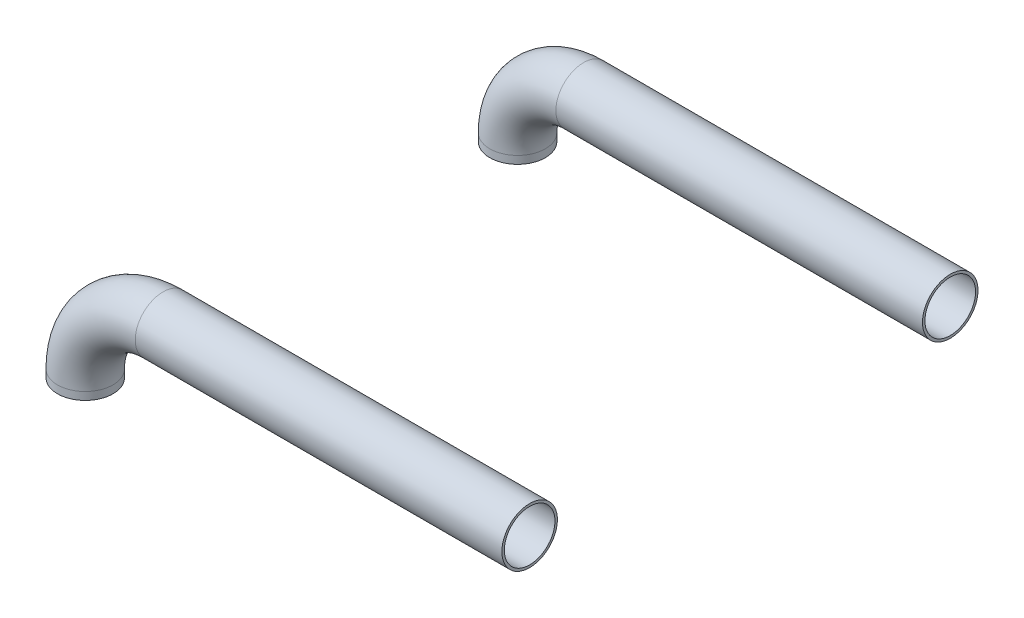
ISO-10303-21;
HEADER;
FILE_DESCRIPTION(('STEP AP214'),'2;1');
FILE_NAME('part.step','',(''),(''),'','','');
FILE_SCHEMA(('AUTOMOTIVE_DESIGN { 1 0 10303 214 1 1 1 1 }'));
ENDSEC;
DATA;
#1=APPLICATION_CONTEXT('core data for automotive mechanical design processes');
#2=APPLICATION_PROTOCOL_DEFINITION('international standard','automotive_design',2000,#1);
#3=PRODUCT_CONTEXT('',#1,'mechanical');
#4=PRODUCT('Part','Part','',(#3));
#5=PRODUCT_RELATED_PRODUCT_CATEGORY('part','',(#4));
#6=PRODUCT_DEFINITION_FORMATION('','',#4);
#7=PRODUCT_DEFINITION_CONTEXT('part definition',#1,'design');
#8=PRODUCT_DEFINITION('design','',#6,#7);
#9=PRODUCT_DEFINITION_SHAPE('','',#8);
#10=(LENGTH_UNIT() NAMED_UNIT(*) SI_UNIT(.MILLI.,.METRE.));
#11=(NAMED_UNIT(*) PLANE_ANGLE_UNIT() SI_UNIT($,.RADIAN.));
#12=(NAMED_UNIT(*) SI_UNIT($,.STERADIAN.) SOLID_ANGLE_UNIT());
#13=UNCERTAINTY_MEASURE_WITH_UNIT(LENGTH_MEASURE(1.E-05),#10,'distance_accuracy_value','');
#14=(GEOMETRIC_REPRESENTATION_CONTEXT(3) GLOBAL_UNCERTAINTY_ASSIGNED_CONTEXT((#13)) GLOBAL_UNIT_ASSIGNED_CONTEXT((#10,
#11,#12)) REPRESENTATION_CONTEXT('',''));
#15=CARTESIAN_POINT('',(0.,0.,0.));
#16=DIRECTION('',(0.,0.,1.));
#17=DIRECTION('',(1.,0.,0.));
#18=AXIS2_PLACEMENT_3D('',#15,#16,#17);
#19=CARTESIAN_POINT('',(386.894037312899,284.8,-164.945872952095));
#20=DIRECTION('',(0.,1.,2.40312621775402E-13));
#21=DIRECTION('',(0.,-2.40312621775402E-13,1.));
#22=AXIS2_PLACEMENT_3D('',#19,#20,#21);
#23=CYLINDRICAL_SURFACE('',#22,25.);
#24=CARTESIAN_POINT('',(386.894037312899,284.833265673216,-164.945872952095));
#25=DIRECTION('',(0.,1.,0.));
#26=DIRECTION('',(0.,0.,1.));
#27=AXIS2_PLACEMENT_3D('',#24,#25,#26);
#28=CIRCLE('',#27,25.);
#29=CARTESIAN_POINT('',(386.894037312899,284.833265673216,-139.945872952095));
#30=VERTEX_POINT('',#29);
#31=EDGE_CURVE('E72',#30,#30,#28,.T.);
#32=ORIENTED_EDGE('',*,*,#31,.F.);
#33=EDGE_LOOP('',(#32));
#34=FACE_BOUND('',#33,.T.);
#35=CARTESIAN_POINT('',(386.894037312899,284.8,-164.945872952095));
#36=DIRECTION('',(0.,1.,0.));
#37=DIRECTION('',(0.,0.,1.));
#38=AXIS2_PLACEMENT_3D('',#35,#36,#37);
#39=CIRCLE('',#38,25.);
#40=CARTESIAN_POINT('',(386.894037312899,284.8,-139.945872952095));
#41=VERTEX_POINT('',#40);
#42=EDGE_CURVE('E69',#41,#41,#39,.T.);
#43=ORIENTED_EDGE('',*,*,#42,.T.);
#44=EDGE_LOOP('',(#43));
#45=FACE_BOUND('',#44,.T.);
#46=ADVANCED_FACE('F48',(#34,#45),#23,.T.);
#47=CARTESIAN_POINT('',(386.894037312899,284.83326567316,-164.945872952021));
#48=DIRECTION('',(0.,1.,0.));
#49=DIRECTION('',(0.,0.,1.));
#50=AXIS2_PLACEMENT_3D('',#47,#48,#49);
#51=CYLINDRICAL_SURFACE('',#50,25.);
#52=CARTESIAN_POINT('',(386.894037312899,291.779134478262,-164.945872952021));
#53=DIRECTION('',(0.,1.,0.));
#54=DIRECTION('',(0.,0.,1.));
#55=AXIS2_PLACEMENT_3D('',#52,#53,#54);
#56=CIRCLE('',#55,25.);
#57=CARTESIAN_POINT('',(361.894037312899,291.779134478239,-164.945872952019));
#58=VERTEX_POINT('',#57);
#59=EDGE_CURVE('E74',#58,#58,#56,.T.);
#60=ORIENTED_EDGE('',*,*,#59,.F.);
#61=EDGE_LOOP('',(#60));
#62=FACE_BOUND('',#61,.T.);
#63=ORIENTED_EDGE('',*,*,#31,.T.);
#64=EDGE_LOOP('',(#63));
#65=FACE_BOUND('',#64,.T.);
#66=ADVANCED_FACE('F84',(#62,#65),#51,.T.);
#67=CARTESIAN_POINT('',(446.352930789313,291.779134478318,-164.945872952026));
#68=DIRECTION('',(0.,0.,-1.));
#69=DIRECTION('',(-1.,0.,0.));
#70=AXIS2_PLACEMENT_3D('',#67,#68,#69);
#71=TOROIDAL_SURFACE('',#70,59.4588934764146,25.);
#72=CARTESIAN_POINT('',(446.352930789222,351.238027954732,-164.945872952094));
#73=DIRECTION('',(1.,0.,-2.40312621775402E-13));
#74=DIRECTION('',(2.40312621775402E-13,0.,1.));
#75=AXIS2_PLACEMENT_3D('',#72,#73,#74);
#76=CIRCLE('',#75,25.);
#77=CARTESIAN_POINT('',(446.352930789184,376.238027954733,-164.945872952123));
#78=VERTEX_POINT('',#77);
#79=EDGE_CURVE('E52',#78,#78,#76,.T.);
#80=CARTESIAN_POINT('',(446.352930789313,291.779134478318,-164.945872952026));
#81=DIRECTION('',(0.,0.,-1.));
#82=DIRECTION('',(-1.,0.,0.));
#83=AXIS2_PLACEMENT_3D('',#80,#81,#82);
#84=CIRCLE('',#83,84.4588934764146);
#85=EDGE_CURVE('',#58,#78,#84,.T.);
#86=ORIENTED_EDGE('',*,*,#59,.T.);
#87=ORIENTED_EDGE('',*,*,#79,.F.);
#88=ORIENTED_EDGE('',*,*,#85,.T.);
#89=ORIENTED_EDGE('',*,*,#85,.F.);
#90=EDGE_LOOP('',(#86,#88,#87,#89));
#91=FACE_BOUND('',#90,.T.);
#92=ADVANCED_FACE('F82',(#91),#71,.T.);
#93=CARTESIAN_POINT('',(446.352930789223,351.238027954733,-164.945872952095));
#94=DIRECTION('',(1.,0.,0.));
#95=DIRECTION('',(0.,0.,-1.));
#96=AXIS2_PLACEMENT_3D('',#93,#94,#95);
#97=CYLINDRICAL_SURFACE('',#96,25.);
#98=CARTESIAN_POINT('',(776.352930789223,351.238027954733,-164.945872952095));
#99=DIRECTION('',(1.,0.,-2.3913511250686E-13));
#100=DIRECTION('',(2.3913511250686E-13,0.,1.));
#101=AXIS2_PLACEMENT_3D('',#98,#99,#100);
#102=CIRCLE('',#101,25.);
#103=CARTESIAN_POINT('',(776.352930789229,351.238027954733,-139.945872952095));
#104=VERTEX_POINT('',#103);
#105=EDGE_CURVE('E65',#104,#104,#102,.T.);
#106=ORIENTED_EDGE('',*,*,#105,.F.);
#107=EDGE_LOOP('',(#106));
#108=FACE_BOUND('',#107,.T.);
#109=ORIENTED_EDGE('',*,*,#79,.T.);
#110=EDGE_LOOP('',(#109));
#111=FACE_BOUND('',#110,.T.);
#112=ADVANCED_FACE('F50',(#108,#111),#97,.T.);
#113=CARTESIAN_POINT('',(386.894037312899,284.8,-164.945872952095));
#114=DIRECTION('',(0.,1.,0.));
#115=DIRECTION('',(0.,0.,1.));
#116=AXIS2_PLACEMENT_3D('',#113,#114,#115);
#117=PLANE('',#116);
#118=CARTESIAN_POINT('',(386.894037312899,284.8,-164.945872952095));
#119=DIRECTION('',(0.,1.,0.));
#120=DIRECTION('',(0.,0.,1.));
#121=AXIS2_PLACEMENT_3D('',#118,#119,#120);
#122=CIRCLE('',#121,22.8);
#123=CARTESIAN_POINT('',(386.894037312899,284.8,-142.145872952095));
#124=VERTEX_POINT('',#123);
#125=EDGE_CURVE('E68',#124,#124,#122,.F.);
#126=ORIENTED_EDGE('',*,*,#125,.F.);
#127=EDGE_LOOP('',(#126));
#128=FACE_BOUND('',#127,.T.);
#129=ORIENTED_EDGE('',*,*,#42,.F.);
#130=EDGE_LOOP('',(#129));
#131=FACE_BOUND('',#130,.T.);
#132=ADVANCED_FACE('F89',(#128,#131),#117,.F.);
#133=CARTESIAN_POINT('',(776.352930789223,351.238027954733,-164.945872952095));
#134=DIRECTION('',(1.,0.,-2.3913511250686E-13));
#135=DIRECTION('',(2.3913511250686E-13,0.,1.));
#136=AXIS2_PLACEMENT_3D('',#133,#134,#135);
#137=PLANE('',#136);
#138=CARTESIAN_POINT('',(776.352930789223,351.238027954733,-164.945872952095));
#139=DIRECTION('',(1.,0.,-2.3913511250686E-13));
#140=DIRECTION('',(2.3913511250686E-13,0.,1.));
#141=AXIS2_PLACEMENT_3D('',#138,#139,#140);
#142=CIRCLE('',#141,22.8);
#143=CARTESIAN_POINT('',(776.352930789228,351.238027954733,-142.145872952095));
#144=VERTEX_POINT('',#143);
#145=EDGE_CURVE('E11',#144,#144,#142,.F.);
#146=ORIENTED_EDGE('',*,*,#145,.T.);
#147=EDGE_LOOP('',(#146));
#148=FACE_BOUND('',#147,.T.);
#149=ORIENTED_EDGE('',*,*,#105,.T.);
#150=EDGE_LOOP('',(#149));
#151=FACE_BOUND('',#150,.T.);
#152=ADVANCED_FACE('F107',(#148,#151),#137,.T.);
#153=CARTESIAN_POINT('',(386.894037312899,284.8,-164.945872952095));
#154=DIRECTION('',(0.,1.,2.40312621775402E-13));
#155=DIRECTION('',(0.,-2.40312621775402E-13,1.));
#156=AXIS2_PLACEMENT_3D('',#153,#154,#155);
#157=CYLINDRICAL_SURFACE('',#156,22.8);
#158=CARTESIAN_POINT('',(386.894037312899,284.833265673216,-164.945872952095));
#159=DIRECTION('',(0.,1.,0.));
#160=DIRECTION('',(0.,0.,1.));
#161=AXIS2_PLACEMENT_3D('',#158,#159,#160);
#162=CIRCLE('',#161,22.8);
#163=CARTESIAN_POINT('',(386.894037312899,284.833265673216,-142.145872952095));
#164=VERTEX_POINT('',#163);
#165=EDGE_CURVE('E207',#164,#164,#162,.F.);
#166=ORIENTED_EDGE('',*,*,#165,.F.);
#167=EDGE_LOOP('',(#166));
#168=FACE_BOUND('',#167,.T.);
#169=ORIENTED_EDGE('',*,*,#125,.T.);
#170=EDGE_LOOP('',(#169));
#171=FACE_BOUND('',#170,.T.);
#172=ADVANCED_FACE('F110',(#168,#171),#157,.F.);
#173=CARTESIAN_POINT('',(386.894037312899,284.83326567316,-164.945872952021));
#174=DIRECTION('',(0.,1.,0.));
#175=DIRECTION('',(0.,0.,1.));
#176=AXIS2_PLACEMENT_3D('',#173,#174,#175);
#177=CYLINDRICAL_SURFACE('',#176,22.8);
#178=CARTESIAN_POINT('',(386.894037312899,291.779134478262,-164.945872952021));
#179=DIRECTION('',(0.,1.,0.));
#180=DIRECTION('',(0.,0.,1.));
#181=AXIS2_PLACEMENT_3D('',#178,#179,#180);
#182=CIRCLE('',#181,22.8);
#183=CARTESIAN_POINT('',(364.094037312899,291.779134478241,-164.945872952019));
#184=VERTEX_POINT('',#183);
#185=EDGE_CURVE('E61',#184,#184,#182,.F.);
#186=ORIENTED_EDGE('',*,*,#185,.F.);
#187=EDGE_LOOP('',(#186));
#188=FACE_BOUND('',#187,.T.);
#189=ORIENTED_EDGE('',*,*,#165,.T.);
#190=EDGE_LOOP('',(#189));
#191=FACE_BOUND('',#190,.T.);
#192=ADVANCED_FACE('F101',(#188,#191),#177,.F.);
#193=CARTESIAN_POINT('',(446.352930789313,291.779134478318,-164.945872952026));
#194=DIRECTION('',(0.,0.,-1.));
#195=DIRECTION('',(-1.,0.,0.));
#196=AXIS2_PLACEMENT_3D('',#193,#194,#195);
#197=TOROIDAL_SURFACE('',#196,59.4588934764146,22.8);
#198=CARTESIAN_POINT('',(446.352930789222,351.238027954732,-164.945872952094));
#199=DIRECTION('',(1.,0.,-2.40312621775402E-13));
#200=DIRECTION('',(2.40312621775402E-13,0.,1.));
#201=AXIS2_PLACEMENT_3D('',#198,#199,#200);
#202=CIRCLE('',#201,22.8);
#203=CARTESIAN_POINT('',(446.352930789187,374.038027954732,-164.945872952121));
#204=VERTEX_POINT('',#203);
#205=EDGE_CURVE('E56',#204,#204,#202,.F.);
#206=CARTESIAN_POINT('',(446.352930789313,291.779134478318,-164.945872952026));
#207=DIRECTION('',(0.,0.,-1.));
#208=DIRECTION('',(-1.,0.,0.));
#209=AXIS2_PLACEMENT_3D('',#206,#207,#208);
#210=CIRCLE('',#209,82.2588934764145);
#211=EDGE_CURVE('',#184,#204,#210,.T.);
#212=ORIENTED_EDGE('',*,*,#185,.T.);
#213=ORIENTED_EDGE('',*,*,#205,.F.);
#214=ORIENTED_EDGE('',*,*,#211,.T.);
#215=ORIENTED_EDGE('',*,*,#211,.F.);
#216=EDGE_LOOP('',(#212,#214,#213,#215));
#217=FACE_BOUND('',#216,.T.);
#218=ADVANCED_FACE('F95',(#217),#197,.F.);
#219=CARTESIAN_POINT('',(446.352930789223,351.238027954733,-164.945872952095));
#220=DIRECTION('',(1.,0.,0.));
#221=DIRECTION('',(0.,0.,-1.));
#222=AXIS2_PLACEMENT_3D('',#219,#220,#221);
#223=CYLINDRICAL_SURFACE('',#222,22.8);
#224=ORIENTED_EDGE('',*,*,#145,.F.);
#225=EDGE_LOOP('',(#224));
#226=FACE_BOUND('',#225,.T.);
#227=ORIENTED_EDGE('',*,*,#205,.T.);
#228=EDGE_LOOP('',(#227));
#229=FACE_BOUND('',#228,.T.);
#230=ADVANCED_FACE('F93',(#226,#229),#223,.F.);
#231=CLOSED_SHELL('',(#46,#66,#92,#112,#132,#152,#172,#192,#218,#230));
#232=MANIFOLD_SOLID_BREP('B2',#231);
#233=CARTESIAN_POINT('',(376.352930789313,284.8,213.653049782411));
#234=DIRECTION('',(0.,1.,2.40312621775402E-13));
#235=DIRECTION('',(0.,-2.40312621775402E-13,1.));
#236=AXIS2_PLACEMENT_3D('',#233,#234,#235);
#237=CYLINDRICAL_SURFACE('',#236,25.);
#238=CARTESIAN_POINT('',(376.352930789313,284.833265673216,213.653049782411));
#239=DIRECTION('',(0.,1.,0.));
#240=DIRECTION('',(0.,0.,1.));
#241=AXIS2_PLACEMENT_3D('',#238,#239,#240);
#242=CIRCLE('',#241,25.);
#243=CARTESIAN_POINT('',(376.352930789313,284.833265673216,238.653049782411));
#244=VERTEX_POINT('',#243);
#245=EDGE_CURVE('E247',#244,#244,#242,.T.);
#246=ORIENTED_EDGE('',*,*,#245,.F.);
#247=EDGE_LOOP('',(#246));
#248=FACE_BOUND('',#247,.T.);
#249=CARTESIAN_POINT('',(376.352930789313,284.8,213.653049782411));
#250=DIRECTION('',(0.,1.,0.));
#251=DIRECTION('',(0.,0.,1.));
#252=AXIS2_PLACEMENT_3D('',#249,#250,#251);
#253=CIRCLE('',#252,25.);
#254=CARTESIAN_POINT('',(376.352930789313,284.8,238.653049782411));
#255=VERTEX_POINT('',#254);
#256=EDGE_CURVE('E243',#255,#255,#253,.T.);
#257=ORIENTED_EDGE('',*,*,#256,.T.);
#258=EDGE_LOOP('',(#257));
#259=FACE_BOUND('',#258,.T.);
#260=ADVANCED_FACE('F219',(#248,#259),#237,.T.);
#261=CARTESIAN_POINT('',(376.352930789313,284.83326567316,213.653049782486));
#262=DIRECTION('',(0.,1.,0.));
#263=DIRECTION('',(0.,0.,1.));
#264=AXIS2_PLACEMENT_3D('',#261,#262,#263);
#265=CYLINDRICAL_SURFACE('',#264,25.);
#266=CARTESIAN_POINT('',(376.352930789313,291.779134478262,213.653049782485));
#267=DIRECTION('',(0.,1.,0.));
#268=DIRECTION('',(0.,0.,1.));
#269=AXIS2_PLACEMENT_3D('',#266,#267,#268);
#270=CIRCLE('',#269,25.);
#271=CARTESIAN_POINT('',(351.352930789313,291.779134478242,213.653049782487));
#272=VERTEX_POINT('',#271);
#273=EDGE_CURVE('E250',#272,#272,#270,.T.);
#274=ORIENTED_EDGE('',*,*,#273,.F.);
#275=EDGE_LOOP('',(#274));
#276=FACE_BOUND('',#275,.T.);
#277=ORIENTED_EDGE('',*,*,#245,.T.);
#278=EDGE_LOOP('',(#277));
#279=FACE_BOUND('',#278,.T.);
#280=ADVANCED_FACE('F262',(#276,#279),#265,.T.);
#281=CARTESIAN_POINT('',(446.352930789313,291.779134478318,213.65304978248));
#282=DIRECTION('',(0.,0.,-1.));
#283=DIRECTION('',(-1.,0.,0.));
#284=AXIS2_PLACEMENT_3D('',#281,#282,#283);
#285=TOROIDAL_SURFACE('',#284,70.,25.);
#286=CARTESIAN_POINT('',(446.352930789313,361.779134478318,213.653049782412));
#287=DIRECTION('',(1.,0.,-2.40312621775402E-13));
#288=DIRECTION('',(2.40312621775402E-13,0.,1.));
#289=AXIS2_PLACEMENT_3D('',#286,#287,#288);
#290=CIRCLE('',#289,25.);
#291=CARTESIAN_POINT('',(446.352930789313,386.779134478318,213.653049782387));
#292=VERTEX_POINT('',#291);
#293=EDGE_CURVE('E223',#292,#292,#290,.T.);
#294=CARTESIAN_POINT('',(446.352930789313,291.779134478318,213.65304978248));
#295=DIRECTION('',(0.,0.,-1.));
#296=DIRECTION('',(-1.,0.,0.));
#297=AXIS2_PLACEMENT_3D('',#294,#295,#296);
#298=CIRCLE('',#297,95.);
#299=EDGE_CURVE('',#272,#292,#298,.T.);
#300=ORIENTED_EDGE('',*,*,#273,.T.);
#301=ORIENTED_EDGE('',*,*,#293,.F.);
#302=ORIENTED_EDGE('',*,*,#299,.T.);
#303=ORIENTED_EDGE('',*,*,#299,.F.);
#304=EDGE_LOOP('',(#300,#302,#301,#303));
#305=FACE_BOUND('',#304,.T.);
#306=ADVANCED_FACE('F260',(#305),#285,.T.);
#307=CARTESIAN_POINT('',(446.352930789313,361.779134478318,213.653049782411));
#308=DIRECTION('',(1.,0.,0.));
#309=DIRECTION('',(0.,0.,-1.));
#310=AXIS2_PLACEMENT_3D('',#307,#308,#309);
#311=CYLINDRICAL_SURFACE('',#310,25.);
#312=CARTESIAN_POINT('',(776.352930789313,361.779134478318,213.653049782411));
#313=DIRECTION('',(1.,0.,-2.3913511250686E-13));
#314=DIRECTION('',(2.3913511250686E-13,0.,1.));
#315=AXIS2_PLACEMENT_3D('',#312,#313,#314);
#316=CIRCLE('',#315,25.);
#317=CARTESIAN_POINT('',(776.352930789319,361.779134478318,238.653049782411));
#318=VERTEX_POINT('',#317);
#319=EDGE_CURVE('E238',#318,#318,#316,.T.);
#320=ORIENTED_EDGE('',*,*,#319,.F.);
#321=EDGE_LOOP('',(#320));
#322=FACE_BOUND('',#321,.T.);
#323=ORIENTED_EDGE('',*,*,#293,.T.);
#324=EDGE_LOOP('',(#323));
#325=FACE_BOUND('',#324,.T.);
#326=ADVANCED_FACE('F221',(#322,#325),#311,.T.);
#327=CARTESIAN_POINT('',(376.352930789313,284.8,213.653049782411));
#328=DIRECTION('',(0.,1.,0.));
#329=DIRECTION('',(0.,0.,1.));
#330=AXIS2_PLACEMENT_3D('',#327,#328,#329);
#331=PLANE('',#330);
#332=CARTESIAN_POINT('',(376.352930789313,284.8,213.653049782411));
#333=DIRECTION('',(0.,1.,0.));
#334=DIRECTION('',(0.,0.,1.));
#335=AXIS2_PLACEMENT_3D('',#332,#333,#334);
#336=CIRCLE('',#335,22.8);
#337=CARTESIAN_POINT('',(376.352930789313,284.8,236.453049782411));
#338=VERTEX_POINT('',#337);
#339=EDGE_CURVE('E242',#338,#338,#336,.F.);
#340=ORIENTED_EDGE('',*,*,#339,.F.);
#341=EDGE_LOOP('',(#340));
#342=FACE_BOUND('',#341,.T.);
#343=ORIENTED_EDGE('',*,*,#256,.F.);
#344=EDGE_LOOP('',(#343));
#345=FACE_BOUND('',#344,.T.);
#346=ADVANCED_FACE('F267',(#342,#345),#331,.F.);
#347=CARTESIAN_POINT('',(776.352930789313,361.779134478318,213.653049782411));
#348=DIRECTION('',(1.,0.,-2.3913511250686E-13));
#349=DIRECTION('',(2.3913511250686E-13,0.,1.));
#350=AXIS2_PLACEMENT_3D('',#347,#348,#349);
#351=PLANE('',#350);
#352=CARTESIAN_POINT('',(776.352930789313,361.779134478318,213.653049782411));
#353=DIRECTION('',(1.,0.,-2.3913511250686E-13));
#354=DIRECTION('',(2.3913511250686E-13,0.,1.));
#355=AXIS2_PLACEMENT_3D('',#352,#353,#354);
#356=CIRCLE('',#355,22.8);
#357=CARTESIAN_POINT('',(776.352930789319,361.779134478318,236.453049782411));
#358=VERTEX_POINT('',#357);
#359=EDGE_CURVE('E47',#358,#358,#356,.F.);
#360=ORIENTED_EDGE('',*,*,#359,.T.);
#361=EDGE_LOOP('',(#360));
#362=FACE_BOUND('',#361,.T.);
#363=ORIENTED_EDGE('',*,*,#319,.T.);
#364=EDGE_LOOP('',(#363));
#365=FACE_BOUND('',#364,.T.);
#366=ADVANCED_FACE('F285',(#362,#365),#351,.T.);
#367=CARTESIAN_POINT('',(376.352930789313,284.8,213.653049782411));
#368=DIRECTION('',(0.,1.,2.40312621775402E-13));
#369=DIRECTION('',(0.,-2.40312621775402E-13,1.));
#370=AXIS2_PLACEMENT_3D('',#367,#368,#369);
#371=CYLINDRICAL_SURFACE('',#370,22.8);
#372=CARTESIAN_POINT('',(376.352930789313,284.833265673216,213.653049782411));
#373=DIRECTION('',(0.,1.,0.));
#374=DIRECTION('',(0.,0.,1.));
#375=AXIS2_PLACEMENT_3D('',#372,#373,#374);
#376=CIRCLE('',#375,22.8);
#377=CARTESIAN_POINT('',(376.352930789313,284.833265673216,236.453049782411));
#378=VERTEX_POINT('',#377);
#379=EDGE_CURVE('E385',#378,#378,#376,.F.);
#380=ORIENTED_EDGE('',*,*,#379,.F.);
#381=EDGE_LOOP('',(#380));
#382=FACE_BOUND('',#381,.T.);
#383=ORIENTED_EDGE('',*,*,#339,.T.);
#384=EDGE_LOOP('',(#383));
#385=FACE_BOUND('',#384,.T.);
#386=ADVANCED_FACE('F288',(#382,#385),#371,.F.);
#387=CARTESIAN_POINT('',(376.352930789313,284.83326567316,213.653049782486));
#388=DIRECTION('',(0.,1.,0.));
#389=DIRECTION('',(0.,0.,1.));
#390=AXIS2_PLACEMENT_3D('',#387,#388,#389);
#391=CYLINDRICAL_SURFACE('',#390,22.8);
#392=CARTESIAN_POINT('',(376.352930789313,291.779134478262,213.653049782485));
#393=DIRECTION('',(0.,1.,0.));
#394=DIRECTION('',(0.,0.,1.));
#395=AXIS2_PLACEMENT_3D('',#392,#393,#394);
#396=CIRCLE('',#395,22.8);
#397=CARTESIAN_POINT('',(353.552930789313,291.779134478244,213.653049782487));
#398=VERTEX_POINT('',#397);
#399=EDGE_CURVE('E234',#398,#398,#396,.F.);
#400=ORIENTED_EDGE('',*,*,#399,.F.);
#401=EDGE_LOOP('',(#400));
#402=FACE_BOUND('',#401,.T.);
#403=ORIENTED_EDGE('',*,*,#379,.T.);
#404=EDGE_LOOP('',(#403));
#405=FACE_BOUND('',#404,.T.);
#406=ADVANCED_FACE('F279',(#402,#405),#391,.F.);
#407=CARTESIAN_POINT('',(446.352930789313,291.779134478318,213.65304978248));
#408=DIRECTION('',(0.,0.,-1.));
#409=DIRECTION('',(-1.,0.,0.));
#410=AXIS2_PLACEMENT_3D('',#407,#408,#409);
#411=TOROIDAL_SURFACE('',#410,70.,22.8);
#412=CARTESIAN_POINT('',(446.352930789313,361.779134478318,213.653049782412));
#413=DIRECTION('',(1.,0.,-2.40312621775402E-13));
#414=DIRECTION('',(2.40312621775402E-13,0.,1.));
#415=AXIS2_PLACEMENT_3D('',#412,#413,#414);
#416=CIRCLE('',#415,22.8);
#417=CARTESIAN_POINT('',(446.352930789313,384.579134478318,213.653049782389));
#418=VERTEX_POINT('',#417);
#419=EDGE_CURVE('E228',#418,#418,#416,.F.);
#420=CARTESIAN_POINT('',(446.352930789313,291.779134478318,213.65304978248));
#421=DIRECTION('',(0.,0.,-1.));
#422=DIRECTION('',(-1.,0.,0.));
#423=AXIS2_PLACEMENT_3D('',#420,#421,#422);
#424=CIRCLE('',#423,92.8);
#425=EDGE_CURVE('',#398,#418,#424,.T.);
#426=ORIENTED_EDGE('',*,*,#399,.T.);
#427=ORIENTED_EDGE('',*,*,#419,.F.);
#428=ORIENTED_EDGE('',*,*,#425,.T.);
#429=ORIENTED_EDGE('',*,*,#425,.F.);
#430=EDGE_LOOP('',(#426,#428,#427,#429));
#431=FACE_BOUND('',#430,.T.);
#432=ADVANCED_FACE('F273',(#431),#411,.F.);
#433=CARTESIAN_POINT('',(446.352930789313,361.779134478318,213.653049782411));
#434=DIRECTION('',(1.,0.,0.));
#435=DIRECTION('',(0.,0.,-1.));
#436=AXIS2_PLACEMENT_3D('',#433,#434,#435);
#437=CYLINDRICAL_SURFACE('',#436,22.8);
#438=ORIENTED_EDGE('',*,*,#359,.F.);
#439=EDGE_LOOP('',(#438));
#440=FACE_BOUND('',#439,.T.);
#441=ORIENTED_EDGE('',*,*,#419,.T.);
#442=EDGE_LOOP('',(#441));
#443=FACE_BOUND('',#442,.T.);
#444=ADVANCED_FACE('F271',(#440,#443),#437,.F.);
#445=CLOSED_SHELL('',(#260,#280,#306,#326,#346,#366,#386,#406,#432,#444));
#446=MANIFOLD_SOLID_BREP('B6',#445);
#447=ADVANCED_BREP_SHAPE_REPRESENTATION('',(#18,#232,#446),#14);
#448=SHAPE_DEFINITION_REPRESENTATION(#9,#447);
ENDSEC;
END-ISO-10303-21;
